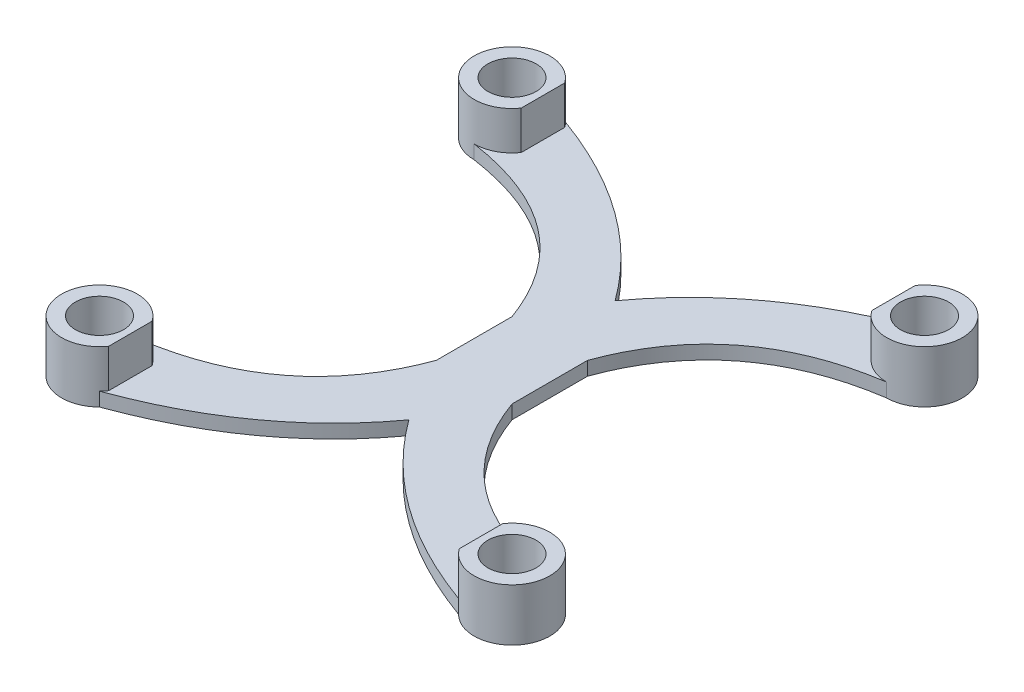
ISO-10303-21;
HEADER;
FILE_DESCRIPTION(('STEP AP214'),'2;1');
FILE_NAME('part.step','',(''),(''),'','','');
FILE_SCHEMA(('AUTOMOTIVE_DESIGN { 1 0 10303 214 1 1 1 1 }'));
ENDSEC;
DATA;
#1=APPLICATION_CONTEXT('core data for automotive mechanical design processes');
#2=APPLICATION_PROTOCOL_DEFINITION('international standard','automotive_design',2000,#1);
#3=PRODUCT_CONTEXT('',#1,'mechanical');
#4=PRODUCT('Part','Part','',(#3));
#5=PRODUCT_RELATED_PRODUCT_CATEGORY('part','',(#4));
#6=PRODUCT_DEFINITION_FORMATION('','',#4);
#7=PRODUCT_DEFINITION_CONTEXT('part definition',#1,'design');
#8=PRODUCT_DEFINITION('design','',#6,#7);
#9=PRODUCT_DEFINITION_SHAPE('','',#8);
#10=(LENGTH_UNIT() NAMED_UNIT(*) SI_UNIT(.MILLI.,.METRE.));
#11=(NAMED_UNIT(*) PLANE_ANGLE_UNIT() SI_UNIT($,.RADIAN.));
#12=(NAMED_UNIT(*) SI_UNIT($,.STERADIAN.) SOLID_ANGLE_UNIT());
#13=UNCERTAINTY_MEASURE_WITH_UNIT(LENGTH_MEASURE(1.E-05),#10,'distance_accuracy_value','');
#14=(GEOMETRIC_REPRESENTATION_CONTEXT(3) GLOBAL_UNCERTAINTY_ASSIGNED_CONTEXT((#13)) GLOBAL_UNIT_ASSIGNED_CONTEXT((#10,
#11,#12)) REPRESENTATION_CONTEXT('',''));
#15=CARTESIAN_POINT('',(0.,0.,0.));
#16=DIRECTION('',(0.,0.,1.));
#17=DIRECTION('',(1.,0.,0.));
#18=AXIS2_PLACEMENT_3D('',#15,#16,#17);
#19=CARTESIAN_POINT('',(0.,1.,0.));
#20=DIRECTION('',(0.,1.,0.));
#21=DIRECTION('',(0.,0.,1.));
#22=AXIS2_PLACEMENT_3D('',#19,#20,#21);
#23=PLANE('',#22);
#24=CARTESIAN_POINT('',(13.055456351737,1.,-16.944543648263));
#25=CARTESIAN_POINT('',(1.81322481001826,1.,-12.8640011613613));
#26=CARTESIAN_POINT('',(-2.75,1.,-2.75));
#27=B_SPLINE_CURVE_WITH_KNOTS('',2,(#24,#25,#26),.UNSPECIFIED.,.F.,.F.,(3,3),(0.,1.),.UNSPECIFIED.);
#28=CARTESIAN_POINT('',(13.055456351737,1.,-16.944543648263));
#29=VERTEX_POINT('',#28);
#30=CARTESIAN_POINT('',(5.38024486074207E-11,1.,-7.49999999992625));
#31=VERTEX_POINT('',#30);
#32=EDGE_CURVE('E302',#29,#31,#27,.T.);
#33=ORIENTED_EDGE('',*,*,#32,.T.);
#34=CARTESIAN_POINT('',(-13.055456351737,1.,-16.944543648263));
#35=CARTESIAN_POINT('',(-1.81322481001825,1.,-12.8640011613613));
#36=CARTESIAN_POINT('',(2.75,1.,-2.75));
#37=B_SPLINE_CURVE_WITH_KNOTS('',2,(#34,#35,#36),.UNSPECIFIED.,.F.,.F.,(3,3),(0.,1.),.UNSPECIFIED.);
#38=CARTESIAN_POINT('',(-13.055456351737,1.,-16.944543648263));
#39=VERTEX_POINT('',#38);
#40=EDGE_CURVE('E263',#39,#31,#37,.T.);
#41=ORIENTED_EDGE('',*,*,#40,.F.);
#42=CARTESIAN_POINT('',(-15.,1.,-15.));
#43=DIRECTION('',(0.,1.,0.));
#44=DIRECTION('',(0.,0.,1.));
#45=AXIS2_PLACEMENT_3D('',#42,#43,#44);
#46=CIRCLE('',#45,2.75);
#47=CARTESIAN_POINT('',(-12.75,1.,-16.5811388300842));
#48=VERTEX_POINT('',#47);
#49=EDGE_CURVE('E41',#48,#39,#46,.T.);
#50=ORIENTED_EDGE('',*,*,#49,.F.);
#51=DIRECTION('',(0.,0.,-1.));
#52=VECTOR('',#51,1.);
#53=CARTESIAN_POINT('',(-12.75,1.,-17.75));
#54=LINE('',#53,#52);
#55=CARTESIAN_POINT('',(-12.75,1.,-13.4188611699158));
#56=VERTEX_POINT('',#55);
#57=EDGE_CURVE('E205',#56,#48,#54,.T.);
#58=ORIENTED_EDGE('',*,*,#57,.F.);
#59=CARTESIAN_POINT('',(-15.,1.,-12.25));
#60=VERTEX_POINT('',#59);
#61=EDGE_CURVE('E244',#60,#56,#46,.T.);
#62=ORIENTED_EDGE('',*,*,#61,.F.);
#63=CARTESIAN_POINT('',(-15.,1.,-12.25));
#64=CARTESIAN_POINT('',(-5.70624646356832,1.,-10.8686922382826));
#65=CARTESIAN_POINT('',(-2.75,1.,-2.75));
#66=B_SPLINE_CURVE_WITH_KNOTS('',2,(#63,#64,#65),.UNSPECIFIED.,.F.,.F.,(3,3),(0.,1.),.UNSPECIFIED.);
#67=CARTESIAN_POINT('',(-2.75,1.,-2.75));
#68=VERTEX_POINT('',#67);
#69=EDGE_CURVE('E258',#60,#68,#66,.T.);
#70=ORIENTED_EDGE('',*,*,#69,.T.);
#71=DIRECTION('',(0.,0.,1.));
#72=VECTOR('',#71,1.);
#73=CARTESIAN_POINT('',(-2.75,1.,0.));
#74=LINE('',#73,#72);
#75=CARTESIAN_POINT('',(-2.75,1.,2.75));
#76=VERTEX_POINT('',#75);
#77=EDGE_CURVE('E262',#68,#76,#74,.T.);
#78=ORIENTED_EDGE('',*,*,#77,.T.);
#79=CARTESIAN_POINT('',(-15.,1.,12.25));
#80=CARTESIAN_POINT('',(-5.70624646356832,1.,10.8686922382826));
#81=CARTESIAN_POINT('',(-2.75,1.,2.75));
#82=B_SPLINE_CURVE_WITH_KNOTS('',2,(#79,#80,#81),.UNSPECIFIED.,.F.,.F.,(3,3),(0.,1.),.UNSPECIFIED.);
#83=CARTESIAN_POINT('',(-15.,1.,12.25));
#84=VERTEX_POINT('',#83);
#85=EDGE_CURVE('E389',#84,#76,#82,.T.);
#86=ORIENTED_EDGE('',*,*,#85,.F.);
#87=CARTESIAN_POINT('',(-15.,1.,15.));
#88=DIRECTION('',(0.,1.,0.));
#89=DIRECTION('',(0.,0.,-1.));
#90=AXIS2_PLACEMENT_3D('',#87,#88,#89);
#91=CIRCLE('',#90,2.75);
#92=CARTESIAN_POINT('',(-12.75,1.,13.4188611699158));
#93=VERTEX_POINT('',#92);
#94=EDGE_CURVE('E203',#93,#84,#91,.T.);
#95=ORIENTED_EDGE('',*,*,#94,.F.);
#96=CARTESIAN_POINT('',(-12.75,1.,16.5811388300842));
#97=VERTEX_POINT('',#96);
#98=EDGE_CURVE('E189',#97,#93,#54,.T.);
#99=ORIENTED_EDGE('',*,*,#98,.F.);
#100=CARTESIAN_POINT('',(-13.055456351737,1.,16.944543648263));
#101=VERTEX_POINT('',#100);
#102=EDGE_CURVE('E200',#101,#97,#91,.T.);
#103=ORIENTED_EDGE('',*,*,#102,.F.);
#104=CARTESIAN_POINT('',(-13.055456351737,1.,16.944543648263));
#105=CARTESIAN_POINT('',(-1.81322481001826,1.,12.8640011613613));
#106=CARTESIAN_POINT('',(2.75,1.,2.75));
#107=B_SPLINE_CURVE_WITH_KNOTS('',2,(#104,#105,#106),.UNSPECIFIED.,.F.,.F.,(3,3),(0.,1.),.UNSPECIFIED.);
#108=CARTESIAN_POINT('',(-5.37991960009032E-11,1.,7.49999999992625));
#109=VERTEX_POINT('',#108);
#110=EDGE_CURVE('E249',#101,#109,#107,.T.);
#111=ORIENTED_EDGE('',*,*,#110,.T.);
#112=CARTESIAN_POINT('',(13.055456351737,1.,16.944543648263));
#113=CARTESIAN_POINT('',(1.81322481001826,1.,12.8640011613613));
#114=CARTESIAN_POINT('',(-2.75,1.,2.75));
#115=B_SPLINE_CURVE_WITH_KNOTS('',2,(#112,#113,#114),.UNSPECIFIED.,.F.,.F.,(3,3),(0.,1.),.UNSPECIFIED.);
#116=CARTESIAN_POINT('',(13.055456351737,1.,16.944543648263));
#117=VERTEX_POINT('',#116);
#118=EDGE_CURVE('E338',#117,#109,#115,.T.);
#119=ORIENTED_EDGE('',*,*,#118,.F.);
#120=CARTESIAN_POINT('',(15.,1.,15.));
#121=DIRECTION('',(0.,1.,0.));
#122=DIRECTION('',(0.,0.,1.));
#123=AXIS2_PLACEMENT_3D('',#120,#121,#122);
#124=CIRCLE('',#123,2.75);
#125=CARTESIAN_POINT('',(12.75,1.,16.5811388300842));
#126=VERTEX_POINT('',#125);
#127=EDGE_CURVE('E227',#126,#117,#124,.T.);
#128=ORIENTED_EDGE('',*,*,#127,.F.);
#129=DIRECTION('',(0.,0.,1.));
#130=VECTOR('',#129,1.);
#131=CARTESIAN_POINT('',(12.75,1.,-17.75));
#132=LINE('',#131,#130);
#133=CARTESIAN_POINT('',(12.75,1.,13.4188611699158));
#134=VERTEX_POINT('',#133);
#135=EDGE_CURVE('E544',#134,#126,#132,.T.);
#136=ORIENTED_EDGE('',*,*,#135,.F.);
#137=CARTESIAN_POINT('',(15.,1.,12.25));
#138=VERTEX_POINT('',#137);
#139=EDGE_CURVE('E224',#138,#134,#124,.T.);
#140=ORIENTED_EDGE('',*,*,#139,.F.);
#141=CARTESIAN_POINT('',(15.,1.,12.25));
#142=CARTESIAN_POINT('',(5.70624646356832,1.,10.8686922382826));
#143=CARTESIAN_POINT('',(2.75,1.,2.75));
#144=B_SPLINE_CURVE_WITH_KNOTS('',2,(#141,#142,#143),.UNSPECIFIED.,.F.,.F.,(3,3),(0.,1.),.UNSPECIFIED.);
#145=CARTESIAN_POINT('',(2.75,1.,2.75));
#146=VERTEX_POINT('',#145);
#147=EDGE_CURVE('E334',#138,#146,#144,.T.);
#148=ORIENTED_EDGE('',*,*,#147,.T.);
#149=DIRECTION('',(0.,0.,1.));
#150=VECTOR('',#149,1.);
#151=CARTESIAN_POINT('',(2.75,1.,0.));
#152=LINE('',#151,#150);
#153=CARTESIAN_POINT('',(2.75,1.,-2.75));
#154=VERTEX_POINT('',#153);
#155=EDGE_CURVE('E315',#154,#146,#152,.T.);
#156=ORIENTED_EDGE('',*,*,#155,.F.);
#157=CARTESIAN_POINT('',(15.,1.,-12.25));
#158=CARTESIAN_POINT('',(5.70624646356832,1.,-10.8686922382826));
#159=CARTESIAN_POINT('',(2.75,1.,-2.75));
#160=B_SPLINE_CURVE_WITH_KNOTS('',2,(#157,#158,#159),.UNSPECIFIED.,.F.,.F.,(3,3),(0.,1.),.UNSPECIFIED.);
#161=CARTESIAN_POINT('',(15.,1.,-12.25));
#162=VERTEX_POINT('',#161);
#163=EDGE_CURVE('E307',#162,#154,#160,.T.);
#164=ORIENTED_EDGE('',*,*,#163,.F.);
#165=CARTESIAN_POINT('',(15.,1.,-15.));
#166=DIRECTION('',(0.,1.,0.));
#167=DIRECTION('',(0.,0.,-1.));
#168=AXIS2_PLACEMENT_3D('',#165,#166,#167);
#169=CIRCLE('',#168,2.75);
#170=CARTESIAN_POINT('',(12.75,1.,-13.4188611699158));
#171=VERTEX_POINT('',#170);
#172=EDGE_CURVE('E237',#171,#162,#169,.T.);
#173=ORIENTED_EDGE('',*,*,#172,.F.);
#174=CARTESIAN_POINT('',(12.75,1.,-16.5811388300842));
#175=VERTEX_POINT('',#174);
#176=EDGE_CURVE('E606',#175,#171,#132,.T.);
#177=ORIENTED_EDGE('',*,*,#176,.F.);
#178=EDGE_CURVE('E234',#29,#175,#169,.T.);
#179=ORIENTED_EDGE('',*,*,#178,.F.);
#180=EDGE_LOOP('',(#33,#41,#50,#58,#62,#70,#78,#86,#95,#99,#103,#111,#119,#128,#136,#140,#148,
#156,#164,#173,#177,#179));
#181=FACE_BOUND('',#180,.T.);
#182=ADVANCED_FACE('F37',(#181),#23,.T.);
#183=CARTESIAN_POINT('',(-15.,1.,15.));
#184=DIRECTION('',(0.,-1.,0.));
#185=DIRECTION('',(0.,0.,-1.));
#186=AXIS2_PLACEMENT_3D('',#183,#184,#185);
#187=CYLINDRICAL_SURFACE('',#186,2.75);
#188=DIRECTION('',(0.,-1.,0.));
#189=VECTOR('',#188,1.);
#190=CARTESIAN_POINT('',(-12.75,1.,13.4188611699158));
#191=LINE('',#190,#189);
#192=CARTESIAN_POINT('',(-12.75,3.8,13.4188611699158));
#193=VERTEX_POINT('',#192);
#194=EDGE_CURVE('E196',#93,#193,#191,.F.);
#195=ORIENTED_EDGE('',*,*,#194,.F.);
#196=ORIENTED_EDGE('',*,*,#94,.T.);
#197=DIRECTION('',(0.,-1.,0.));
#198=VECTOR('',#197,1.);
#199=CARTESIAN_POINT('',(-15.,1.,12.25));
#200=LINE('',#199,#198);
#201=CARTESIAN_POINT('',(-15.,0.,12.25));
#202=VERTEX_POINT('',#201);
#203=EDGE_CURVE('E394',#84,#202,#200,.T.);
#204=ORIENTED_EDGE('',*,*,#203,.T.);
#205=CARTESIAN_POINT('',(-15.,0.,15.));
#206=DIRECTION('',(0.,1.,0.));
#207=DIRECTION('',(0.,0.,1.));
#208=AXIS2_PLACEMENT_3D('',#205,#206,#207);
#209=CIRCLE('',#208,2.75);
#210=CARTESIAN_POINT('',(-13.055456351737,0.,16.944543648263));
#211=VERTEX_POINT('',#210);
#212=EDGE_CURVE('E243',#211,#202,#209,.F.);
#213=ORIENTED_EDGE('',*,*,#212,.F.);
#214=DIRECTION('',(0.,-1.,0.));
#215=VECTOR('',#214,1.);
#216=CARTESIAN_POINT('',(-13.055456351737,1.,16.944543648263));
#217=LINE('',#216,#215);
#218=EDGE_CURVE('E208',#101,#211,#217,.T.);
#219=ORIENTED_EDGE('',*,*,#218,.F.);
#220=ORIENTED_EDGE('',*,*,#102,.T.);
#221=DIRECTION('',(0.,-1.,0.));
#222=VECTOR('',#221,1.);
#223=CARTESIAN_POINT('',(-12.75,1.,16.5811388300842));
#224=LINE('',#223,#222);
#225=CARTESIAN_POINT('',(-12.75,3.8,16.5811388300842));
#226=VERTEX_POINT('',#225);
#227=EDGE_CURVE('E186',#226,#97,#224,.T.);
#228=ORIENTED_EDGE('',*,*,#227,.F.);
#229=CARTESIAN_POINT('',(-15.,3.8,15.));
#230=DIRECTION('',(0.,1.,0.));
#231=DIRECTION('',(0.,0.,1.));
#232=AXIS2_PLACEMENT_3D('',#229,#230,#231);
#233=CIRCLE('',#232,2.75);
#234=EDGE_CURVE('E210',#193,#226,#233,.T.);
#235=ORIENTED_EDGE('',*,*,#234,.F.);
#236=EDGE_LOOP('',(#195,#196,#204,#213,#219,#220,#228,#235));
#237=FACE_BOUND('',#236,.T.);
#238=ADVANCED_FACE('F39',(#237),#187,.T.);
#239=DIRECTION('',(0.,-1.,0.));
#240=VECTOR('',#239,1.);
#241=SURFACE_OF_LINEAR_EXTRUSION('',#107,#240);
#242=CARTESIAN_POINT('',(-13.055456351737,0.,16.944543648263));
#243=CARTESIAN_POINT('',(-1.81322481001826,0.,12.8640011613613));
#244=CARTESIAN_POINT('',(2.75,0.,2.75));
#245=B_SPLINE_CURVE_WITH_KNOTS('',2,(#242,#243,#244),.UNSPECIFIED.,.F.,.F.,(3,3),(0.,1.),.UNSPECIFIED.);
#246=CARTESIAN_POINT('',(-5.37991960009032E-11,0.,7.49999999992625));
#247=VERTEX_POINT('',#246);
#248=EDGE_CURVE('E400',#211,#247,#245,.T.);
#249=ORIENTED_EDGE('',*,*,#248,.T.);
#250=DIRECTION('',(0.,-1.,0.));
#251=VECTOR('',#250,1.);
#252=CARTESIAN_POINT('',(-5.37991960009032E-11,1.,7.49999999992625));
#253=LINE('',#252,#251);
#254=EDGE_CURVE('E508',#109,#247,#253,.T.);
#255=ORIENTED_EDGE('',*,*,#254,.F.);
#256=ORIENTED_EDGE('',*,*,#110,.F.);
#257=ORIENTED_EDGE('',*,*,#218,.T.);
#258=EDGE_LOOP('',(#249,#255,#256,#257));
#259=FACE_BOUND('',#258,.T.);
#260=ADVANCED_FACE('F351',(#259),#241,.F.);
#261=DIRECTION('',(0.,-1.,0.));
#262=VECTOR('',#261,1.);
#263=SURFACE_OF_LINEAR_EXTRUSION('',#115,#262);
#264=CARTESIAN_POINT('',(13.055456351737,0.,16.944543648263));
#265=CARTESIAN_POINT('',(1.81322481001826,0.,12.8640011613613));
#266=CARTESIAN_POINT('',(-2.75,0.,2.75));
#267=B_SPLINE_CURVE_WITH_KNOTS('',2,(#264,#265,#266),.UNSPECIFIED.,.F.,.F.,(3,3),(0.,1.),.UNSPECIFIED.);
#268=CARTESIAN_POINT('',(13.055456351737,0.,16.944543648263));
#269=VERTEX_POINT('',#268);
#270=EDGE_CURVE('E404',#269,#247,#267,.T.);
#271=ORIENTED_EDGE('',*,*,#270,.F.);
#272=DIRECTION('',(0.,-1.,0.));
#273=VECTOR('',#272,1.);
#274=CARTESIAN_POINT('',(13.055456351737,1.,16.944543648263));
#275=LINE('',#274,#273);
#276=EDGE_CURVE('E507',#117,#269,#275,.T.);
#277=ORIENTED_EDGE('',*,*,#276,.F.);
#278=ORIENTED_EDGE('',*,*,#118,.T.);
#279=ORIENTED_EDGE('',*,*,#254,.T.);
#280=EDGE_LOOP('',(#271,#277,#278,#279));
#281=FACE_BOUND('',#280,.T.);
#282=ADVANCED_FACE('F349',(#281),#263,.T.);
#283=CARTESIAN_POINT('',(15.,1.,15.));
#284=DIRECTION('',(0.,-1.,0.));
#285=DIRECTION('',(0.,0.,-1.));
#286=AXIS2_PLACEMENT_3D('',#283,#284,#285);
#287=CYLINDRICAL_SURFACE('',#286,2.75);
#288=CARTESIAN_POINT('',(15.,3.8,15.));
#289=DIRECTION('',(0.,1.,0.));
#290=DIRECTION('',(0.,0.,1.));
#291=AXIS2_PLACEMENT_3D('',#288,#289,#290);
#292=CIRCLE('',#291,2.75);
#293=CARTESIAN_POINT('',(12.75,3.8,16.5811388300842));
#294=VERTEX_POINT('',#293);
#295=CARTESIAN_POINT('',(12.75,3.8,13.4188611699158));
#296=VERTEX_POINT('',#295);
#297=EDGE_CURVE('E220',#294,#296,#292,.T.);
#298=ORIENTED_EDGE('',*,*,#297,.F.);
#299=DIRECTION('',(0.,-1.,0.));
#300=VECTOR('',#299,1.);
#301=CARTESIAN_POINT('',(12.75,1.,16.5811388300842));
#302=LINE('',#301,#300);
#303=EDGE_CURVE('E219',#294,#126,#302,.T.);
#304=ORIENTED_EDGE('',*,*,#303,.T.);
#305=ORIENTED_EDGE('',*,*,#127,.T.);
#306=ORIENTED_EDGE('',*,*,#276,.T.);
#307=CARTESIAN_POINT('',(15.,0.,15.));
#308=DIRECTION('',(0.,1.,0.));
#309=DIRECTION('',(0.,0.,1.));
#310=AXIS2_PLACEMENT_3D('',#307,#308,#309);
#311=CIRCLE('',#310,2.75);
#312=CARTESIAN_POINT('',(15.,0.,12.25));
#313=VERTEX_POINT('',#312);
#314=EDGE_CURVE('E412',#269,#313,#311,.T.);
#315=ORIENTED_EDGE('',*,*,#314,.T.);
#316=DIRECTION('',(0.,-1.,0.));
#317=VECTOR('',#316,1.);
#318=CARTESIAN_POINT('',(15.,1.,12.25));
#319=LINE('',#318,#317);
#320=EDGE_CURVE('E504',#138,#313,#319,.T.);
#321=ORIENTED_EDGE('',*,*,#320,.F.);
#322=ORIENTED_EDGE('',*,*,#139,.T.);
#323=DIRECTION('',(0.,-1.,0.));
#324=VECTOR('',#323,1.);
#325=CARTESIAN_POINT('',(12.75,1.,13.4188611699158));
#326=LINE('',#325,#324);
#327=EDGE_CURVE('E553',#134,#296,#326,.F.);
#328=ORIENTED_EDGE('',*,*,#327,.T.);
#329=EDGE_LOOP('',(#298,#304,#305,#306,#315,#321,#322,#328));
#330=FACE_BOUND('',#329,.T.);
#331=ADVANCED_FACE('F331',(#330),#287,.T.);
#332=DIRECTION('',(0.,-1.,0.));
#333=VECTOR('',#332,1.);
#334=SURFACE_OF_LINEAR_EXTRUSION('',#144,#333);
#335=CARTESIAN_POINT('',(15.,0.,12.25));
#336=CARTESIAN_POINT('',(5.70624646356832,0.,10.8686922382826));
#337=CARTESIAN_POINT('',(2.75,0.,2.75));
#338=B_SPLINE_CURVE_WITH_KNOTS('',2,(#335,#336,#337),.UNSPECIFIED.,.F.,.F.,(3,3),(0.,1.),.UNSPECIFIED.);
#339=CARTESIAN_POINT('',(2.75,0.,2.75));
#340=VERTEX_POINT('',#339);
#341=EDGE_CURVE('E417',#313,#340,#338,.T.);
#342=ORIENTED_EDGE('',*,*,#341,.T.);
#343=DIRECTION('',(0.,-1.,0.));
#344=VECTOR('',#343,1.);
#345=CARTESIAN_POINT('',(2.75,1.,2.75));
#346=LINE('',#345,#344);
#347=EDGE_CURVE('E502',#146,#340,#346,.T.);
#348=ORIENTED_EDGE('',*,*,#347,.F.);
#349=ORIENTED_EDGE('',*,*,#147,.F.);
#350=ORIENTED_EDGE('',*,*,#320,.T.);
#351=EDGE_LOOP('',(#342,#348,#349,#350));
#352=FACE_BOUND('',#351,.T.);
#353=ADVANCED_FACE('F327',(#352),#334,.F.);
#354=CARTESIAN_POINT('',(2.75,1.,0.));
#355=DIRECTION('',(1.,0.,0.));
#356=DIRECTION('',(0.,0.,-1.));
#357=AXIS2_PLACEMENT_3D('',#354,#355,#356);
#358=PLANE('',#357);
#359=DIRECTION('',(0.,0.,1.));
#360=VECTOR('',#359,1.);
#361=CARTESIAN_POINT('',(2.75,0.,0.));
#362=LINE('',#361,#360);
#363=CARTESIAN_POINT('',(2.75,0.,-2.75));
#364=VERTEX_POINT('',#363);
#365=EDGE_CURVE('E422',#364,#340,#362,.T.);
#366=ORIENTED_EDGE('',*,*,#365,.F.);
#367=DIRECTION('',(0.,-1.,0.));
#368=VECTOR('',#367,1.);
#369=CARTESIAN_POINT('',(2.75,1.,-2.75));
#370=LINE('',#369,#368);
#371=EDGE_CURVE('E500',#154,#364,#370,.T.);
#372=ORIENTED_EDGE('',*,*,#371,.F.);
#373=ORIENTED_EDGE('',*,*,#155,.T.);
#374=ORIENTED_EDGE('',*,*,#347,.T.);
#375=EDGE_LOOP('',(#366,#372,#373,#374));
#376=FACE_BOUND('',#375,.T.);
#377=ADVANCED_FACE('F323',(#376),#358,.T.);
#378=DIRECTION('',(0.,-1.,0.));
#379=VECTOR('',#378,1.);
#380=SURFACE_OF_LINEAR_EXTRUSION('',#160,#379);
#381=CARTESIAN_POINT('',(15.,0.,-12.25));
#382=CARTESIAN_POINT('',(5.70624646356832,0.,-10.8686922382826));
#383=CARTESIAN_POINT('',(2.75,0.,-2.75));
#384=B_SPLINE_CURVE_WITH_KNOTS('',2,(#381,#382,#383),.UNSPECIFIED.,.F.,.F.,(3,3),(0.,1.),.UNSPECIFIED.);
#385=CARTESIAN_POINT('',(15.,0.,-12.25));
#386=VERTEX_POINT('',#385);
#387=EDGE_CURVE('E428',#386,#364,#384,.T.);
#388=ORIENTED_EDGE('',*,*,#387,.F.);
#389=DIRECTION('',(0.,-1.,0.));
#390=VECTOR('',#389,1.);
#391=CARTESIAN_POINT('',(15.,1.,-12.25));
#392=LINE('',#391,#390);
#393=EDGE_CURVE('E498',#162,#386,#392,.T.);
#394=ORIENTED_EDGE('',*,*,#393,.F.);
#395=ORIENTED_EDGE('',*,*,#163,.T.);
#396=ORIENTED_EDGE('',*,*,#371,.T.);
#397=EDGE_LOOP('',(#388,#394,#395,#396));
#398=FACE_BOUND('',#397,.T.);
#399=ADVANCED_FACE('F320',(#398),#380,.T.);
#400=CARTESIAN_POINT('',(15.,1.,-15.));
#401=DIRECTION('',(0.,-1.,0.));
#402=DIRECTION('',(0.,0.,-1.));
#403=AXIS2_PLACEMENT_3D('',#400,#401,#402);
#404=CYLINDRICAL_SURFACE('',#403,2.75);
#405=DIRECTION('',(0.,-1.,0.));
#406=VECTOR('',#405,1.);
#407=CARTESIAN_POINT('',(12.75,1.,-13.4188611699158));
#408=LINE('',#407,#406);
#409=CARTESIAN_POINT('',(12.75,3.8,-13.4188611699158));
#410=VERTEX_POINT('',#409);
#411=EDGE_CURVE('E62',#171,#410,#408,.F.);
#412=ORIENTED_EDGE('',*,*,#411,.F.);
#413=ORIENTED_EDGE('',*,*,#172,.T.);
#414=ORIENTED_EDGE('',*,*,#393,.T.);
#415=CARTESIAN_POINT('',(15.,0.,-15.));
#416=DIRECTION('',(0.,1.,0.));
#417=DIRECTION('',(0.,0.,1.));
#418=AXIS2_PLACEMENT_3D('',#415,#416,#417);
#419=CIRCLE('',#418,2.75);
#420=CARTESIAN_POINT('',(13.055456351737,0.,-16.944543648263));
#421=VERTEX_POINT('',#420);
#422=EDGE_CURVE('E433',#421,#386,#419,.F.);
#423=ORIENTED_EDGE('',*,*,#422,.F.);
#424=DIRECTION('',(0.,-1.,0.));
#425=VECTOR('',#424,1.);
#426=CARTESIAN_POINT('',(13.055456351737,1.,-16.944543648263));
#427=LINE('',#426,#425);
#428=EDGE_CURVE('E495',#29,#421,#427,.T.);
#429=ORIENTED_EDGE('',*,*,#428,.F.);
#430=ORIENTED_EDGE('',*,*,#178,.T.);
#431=DIRECTION('',(0.,-1.,0.));
#432=VECTOR('',#431,1.);
#433=CARTESIAN_POINT('',(12.75,1.,-16.5811388300842));
#434=LINE('',#433,#432);
#435=CARTESIAN_POINT('',(12.75,3.8,-16.5811388300842));
#436=VERTEX_POINT('',#435);
#437=EDGE_CURVE('E550',#436,#175,#434,.T.);
#438=ORIENTED_EDGE('',*,*,#437,.F.);
#439=CARTESIAN_POINT('',(15.,3.8,-15.));
#440=DIRECTION('',(0.,1.,0.));
#441=DIRECTION('',(0.,0.,1.));
#442=AXIS2_PLACEMENT_3D('',#439,#440,#441);
#443=CIRCLE('',#442,2.75);
#444=EDGE_CURVE('E230',#410,#436,#443,.T.);
#445=ORIENTED_EDGE('',*,*,#444,.F.);
#446=EDGE_LOOP('',(#412,#413,#414,#423,#429,#430,#438,#445));
#447=FACE_BOUND('',#446,.T.);
#448=ADVANCED_FACE('F299',(#447),#404,.T.);
#449=DIRECTION('',(0.,-1.,0.));
#450=VECTOR('',#449,1.);
#451=SURFACE_OF_LINEAR_EXTRUSION('',#27,#450);
#452=CARTESIAN_POINT('',(13.055456351737,0.,-16.944543648263));
#453=CARTESIAN_POINT('',(1.81322481001826,0.,-12.8640011613613));
#454=CARTESIAN_POINT('',(-2.75,0.,-2.75));
#455=B_SPLINE_CURVE_WITH_KNOTS('',2,(#452,#453,#454),.UNSPECIFIED.,.F.,.F.,(3,3),(0.,1.),.UNSPECIFIED.);
#456=CARTESIAN_POINT('',(5.38024486074207E-11,0.,-7.49999999992625));
#457=VERTEX_POINT('',#456);
#458=EDGE_CURVE('E439',#421,#457,#455,.T.);
#459=ORIENTED_EDGE('',*,*,#458,.T.);
#460=DIRECTION('',(0.,-1.,0.));
#461=VECTOR('',#460,1.);
#462=CARTESIAN_POINT('',(5.38024486074207E-11,1.,-7.49999999992625));
#463=LINE('',#462,#461);
#464=EDGE_CURVE('E493',#31,#457,#463,.T.);
#465=ORIENTED_EDGE('',*,*,#464,.F.);
#466=ORIENTED_EDGE('',*,*,#32,.F.);
#467=ORIENTED_EDGE('',*,*,#428,.T.);
#468=EDGE_LOOP('',(#459,#465,#466,#467));
#469=FACE_BOUND('',#468,.T.);
#470=ADVANCED_FACE('F295',(#469),#451,.F.);
#471=DIRECTION('',(0.,-1.,0.));
#472=VECTOR('',#471,1.);
#473=SURFACE_OF_LINEAR_EXTRUSION('',#37,#472);
#474=CARTESIAN_POINT('',(-13.055456351737,0.,-16.944543648263));
#475=CARTESIAN_POINT('',(-1.81322481001825,0.,-12.8640011613613));
#476=CARTESIAN_POINT('',(2.75,0.,-2.75));
#477=B_SPLINE_CURVE_WITH_KNOTS('',2,(#474,#475,#476),.UNSPECIFIED.,.F.,.F.,(3,3),(0.,1.),.UNSPECIFIED.);
#478=CARTESIAN_POINT('',(-13.055456351737,0.,-16.944543648263));
#479=VERTEX_POINT('',#478);
#480=EDGE_CURVE('E444',#479,#457,#477,.T.);
#481=ORIENTED_EDGE('',*,*,#480,.F.);
#482=DIRECTION('',(0.,-1.,0.));
#483=VECTOR('',#482,1.);
#484=CARTESIAN_POINT('',(-13.055456351737,1.,-16.944543648263));
#485=LINE('',#484,#483);
#486=EDGE_CURVE('E496',#39,#479,#485,.T.);
#487=ORIENTED_EDGE('',*,*,#486,.F.);
#488=ORIENTED_EDGE('',*,*,#40,.T.);
#489=ORIENTED_EDGE('',*,*,#464,.T.);
#490=EDGE_LOOP('',(#481,#487,#488,#489));
#491=FACE_BOUND('',#490,.T.);
#492=ADVANCED_FACE('F291',(#491),#473,.T.);
#493=CARTESIAN_POINT('',(-15.,1.,-15.));
#494=DIRECTION('',(0.,-1.,0.));
#495=DIRECTION('',(0.,0.,-1.));
#496=AXIS2_PLACEMENT_3D('',#493,#494,#495);
#497=CYLINDRICAL_SURFACE('',#496,2.75);
#498=CARTESIAN_POINT('',(-15.,3.8,-15.));
#499=DIRECTION('',(0.,1.,0.));
#500=DIRECTION('',(0.,0.,1.));
#501=AXIS2_PLACEMENT_3D('',#498,#499,#500);
#502=CIRCLE('',#501,2.75);
#503=CARTESIAN_POINT('',(-12.75,3.8,-16.5811388300842));
#504=VERTEX_POINT('',#503);
#505=CARTESIAN_POINT('',(-12.75,3.8,-13.4188611699158));
#506=VERTEX_POINT('',#505);
#507=EDGE_CURVE('E240',#504,#506,#502,.T.);
#508=ORIENTED_EDGE('',*,*,#507,.F.);
#509=DIRECTION('',(0.,-1.,0.));
#510=VECTOR('',#509,1.);
#511=CARTESIAN_POINT('',(-12.75,1.,-16.5811388300842));
#512=LINE('',#511,#510);
#513=EDGE_CURVE('E54',#504,#48,#512,.T.);
#514=ORIENTED_EDGE('',*,*,#513,.T.);
#515=ORIENTED_EDGE('',*,*,#49,.T.);
#516=ORIENTED_EDGE('',*,*,#486,.T.);
#517=CARTESIAN_POINT('',(-15.,0.,-15.));
#518=DIRECTION('',(0.,1.,0.));
#519=DIRECTION('',(0.,0.,1.));
#520=AXIS2_PLACEMENT_3D('',#517,#518,#519);
#521=CIRCLE('',#520,2.75);
#522=CARTESIAN_POINT('',(-15.,0.,-12.25));
#523=VERTEX_POINT('',#522);
#524=EDGE_CURVE('E452',#479,#523,#521,.T.);
#525=ORIENTED_EDGE('',*,*,#524,.T.);
#526=DIRECTION('',(0.,-1.,0.));
#527=VECTOR('',#526,1.);
#528=CARTESIAN_POINT('',(-15.,1.,-12.25));
#529=LINE('',#528,#527);
#530=EDGE_CURVE('E264',#60,#523,#529,.T.);
#531=ORIENTED_EDGE('',*,*,#530,.F.);
#532=ORIENTED_EDGE('',*,*,#61,.T.);
#533=DIRECTION('',(0.,-1.,0.));
#534=VECTOR('',#533,1.);
#535=CARTESIAN_POINT('',(-12.75,1.,-13.4188611699158));
#536=LINE('',#535,#534);
#537=EDGE_CURVE('E204',#56,#506,#536,.F.);
#538=ORIENTED_EDGE('',*,*,#537,.T.);
#539=EDGE_LOOP('',(#508,#514,#515,#516,#525,#531,#532,#538));
#540=FACE_BOUND('',#539,.T.);
#541=ADVANCED_FACE('F286',(#540),#497,.T.);
#542=DIRECTION('',(0.,-1.,0.));
#543=VECTOR('',#542,1.);
#544=SURFACE_OF_LINEAR_EXTRUSION('',#66,#543);
#545=CARTESIAN_POINT('',(-15.,0.,-12.25));
#546=CARTESIAN_POINT('',(-5.70624646356832,0.,-10.8686922382826));
#547=CARTESIAN_POINT('',(-2.75,0.,-2.75));
#548=B_SPLINE_CURVE_WITH_KNOTS('',2,(#545,#546,#547),.UNSPECIFIED.,.F.,.F.,(3,3),(0.,1.),.UNSPECIFIED.);
#549=CARTESIAN_POINT('',(-2.75,0.,-2.75));
#550=VERTEX_POINT('',#549);
#551=EDGE_CURVE('E457',#523,#550,#548,.T.);
#552=ORIENTED_EDGE('',*,*,#551,.T.);
#553=DIRECTION('',(0.,-1.,0.));
#554=VECTOR('',#553,1.);
#555=CARTESIAN_POINT('',(-2.75,1.,-2.75));
#556=LINE('',#555,#554);
#557=EDGE_CURVE('E490',#68,#550,#556,.T.);
#558=ORIENTED_EDGE('',*,*,#557,.F.);
#559=ORIENTED_EDGE('',*,*,#69,.F.);
#560=ORIENTED_EDGE('',*,*,#530,.T.);
#561=EDGE_LOOP('',(#552,#558,#559,#560));
#562=FACE_BOUND('',#561,.T.);
#563=ADVANCED_FACE('F281',(#562),#544,.F.);
#564=CARTESIAN_POINT('',(-2.75,1.,0.));
#565=DIRECTION('',(1.,0.,0.));
#566=DIRECTION('',(0.,0.,-1.));
#567=AXIS2_PLACEMENT_3D('',#564,#565,#566);
#568=PLANE('',#567);
#569=DIRECTION('',(0.,0.,1.));
#570=VECTOR('',#569,1.);
#571=CARTESIAN_POINT('',(-2.75,0.,0.));
#572=LINE('',#571,#570);
#573=CARTESIAN_POINT('',(-2.75,0.,2.75));
#574=VERTEX_POINT('',#573);
#575=EDGE_CURVE('E461',#550,#574,#572,.T.);
#576=ORIENTED_EDGE('',*,*,#575,.T.);
#577=DIRECTION('',(0.,-1.,0.));
#578=VECTOR('',#577,1.);
#579=CARTESIAN_POINT('',(-2.75,1.,2.75));
#580=LINE('',#579,#578);
#581=EDGE_CURVE('E488',#76,#574,#580,.T.);
#582=ORIENTED_EDGE('',*,*,#581,.F.);
#583=ORIENTED_EDGE('',*,*,#77,.F.);
#584=ORIENTED_EDGE('',*,*,#557,.T.);
#585=EDGE_LOOP('',(#576,#582,#583,#584));
#586=FACE_BOUND('',#585,.T.);
#587=ADVANCED_FACE('F285',(#586),#568,.F.);
#588=CARTESIAN_POINT('',(-15.,1.,-15.));
#589=DIRECTION('',(0.,-1.,0.));
#590=DIRECTION('',(0.,0.,-1.));
#591=AXIS2_PLACEMENT_3D('',#588,#589,#590);
#592=CYLINDRICAL_SURFACE('',#591,1.75);
#593=CARTESIAN_POINT('',(-15.,0.,-15.));
#594=DIRECTION('',(0.,1.,0.));
#595=DIRECTION('',(0.,0.,1.));
#596=AXIS2_PLACEMENT_3D('',#593,#594,#595);
#597=CIRCLE('',#596,1.75);
#598=CARTESIAN_POINT('',(-15.,0.,-13.25));
#599=VERTEX_POINT('',#598);
#600=EDGE_CURVE('E481',#599,#599,#597,.T.);
#601=ORIENTED_EDGE('',*,*,#600,.F.);
#602=EDGE_LOOP('',(#601));
#603=FACE_BOUND('',#602,.T.);
#604=CARTESIAN_POINT('',(-15.,3.8,-15.));
#605=DIRECTION('',(0.,1.,0.));
#606=DIRECTION('',(0.,0.,1.));
#607=AXIS2_PLACEMENT_3D('',#604,#605,#606);
#608=CIRCLE('',#607,1.75);
#609=CARTESIAN_POINT('',(-15.,3.8,-13.25));
#610=VERTEX_POINT('',#609);
#611=EDGE_CURVE('E233',#610,#610,#608,.T.);
#612=ORIENTED_EDGE('',*,*,#611,.T.);
#613=EDGE_LOOP('',(#612));
#614=FACE_BOUND('',#613,.T.);
#615=ADVANCED_FACE('F376',(#603,#614),#592,.F.);
#616=CARTESIAN_POINT('',(15.,1.,15.));
#617=DIRECTION('',(0.,-1.,0.));
#618=DIRECTION('',(0.,0.,-1.));
#619=AXIS2_PLACEMENT_3D('',#616,#617,#618);
#620=CYLINDRICAL_SURFACE('',#619,1.75);
#621=CARTESIAN_POINT('',(15.,0.,15.));
#622=DIRECTION('',(0.,1.,0.));
#623=DIRECTION('',(0.,0.,1.));
#624=AXIS2_PLACEMENT_3D('',#621,#622,#623);
#625=CIRCLE('',#624,1.75);
#626=CARTESIAN_POINT('',(15.,0.,16.75));
#627=VERTEX_POINT('',#626);
#628=EDGE_CURVE('E478',#627,#627,#625,.T.);
#629=ORIENTED_EDGE('',*,*,#628,.F.);
#630=EDGE_LOOP('',(#629));
#631=FACE_BOUND('',#630,.T.);
#632=CARTESIAN_POINT('',(15.,3.8,15.));
#633=DIRECTION('',(0.,1.,0.));
#634=DIRECTION('',(0.,0.,1.));
#635=AXIS2_PLACEMENT_3D('',#632,#633,#634);
#636=CIRCLE('',#635,1.74999999999999);
#637=CARTESIAN_POINT('',(15.,3.8,16.75));
#638=VERTEX_POINT('',#637);
#639=EDGE_CURVE('E212',#638,#638,#636,.T.);
#640=ORIENTED_EDGE('',*,*,#639,.T.);
#641=EDGE_LOOP('',(#640));
#642=FACE_BOUND('',#641,.T.);
#643=ADVANCED_FACE('F379',(#631,#642),#620,.F.);
#644=CARTESIAN_POINT('',(-15.,1.,15.));
#645=DIRECTION('',(0.,-1.,0.));
#646=DIRECTION('',(0.,0.,-1.));
#647=AXIS2_PLACEMENT_3D('',#644,#645,#646);
#648=CYLINDRICAL_SURFACE('',#647,1.75);
#649=CARTESIAN_POINT('',(-15.,0.,15.));
#650=DIRECTION('',(0.,1.,0.));
#651=DIRECTION('',(0.,0.,1.));
#652=AXIS2_PLACEMENT_3D('',#649,#650,#651);
#653=CIRCLE('',#652,1.75);
#654=CARTESIAN_POINT('',(-15.,0.,16.75));
#655=VERTEX_POINT('',#654);
#656=EDGE_CURVE('E472',#655,#655,#653,.F.);
#657=ORIENTED_EDGE('',*,*,#656,.T.);
#658=EDGE_LOOP('',(#657));
#659=FACE_BOUND('',#658,.T.);
#660=CARTESIAN_POINT('',(-15.,3.8,15.));
#661=DIRECTION('',(0.,1.,0.));
#662=DIRECTION('',(0.,0.,1.));
#663=AXIS2_PLACEMENT_3D('',#660,#661,#662);
#664=CIRCLE('',#663,1.75);
#665=CARTESIAN_POINT('',(-15.,3.8,16.75));
#666=VERTEX_POINT('',#665);
#667=EDGE_CURVE('E214',#666,#666,#664,.T.);
#668=ORIENTED_EDGE('',*,*,#667,.T.);
#669=EDGE_LOOP('',(#668));
#670=FACE_BOUND('',#669,.T.);
#671=ADVANCED_FACE('F383',(#659,#670),#648,.F.);
#672=DIRECTION('',(0.,-1.,0.));
#673=VECTOR('',#672,1.);
#674=SURFACE_OF_LINEAR_EXTRUSION('',#82,#673);
#675=CARTESIAN_POINT('',(-15.,0.,12.25));
#676=CARTESIAN_POINT('',(-5.70624646356832,0.,10.8686922382826));
#677=CARTESIAN_POINT('',(-2.75,0.,2.75));
#678=B_SPLINE_CURVE_WITH_KNOTS('',2,(#675,#676,#677),.UNSPECIFIED.,.F.,.F.,(3,3),(0.,1.),.UNSPECIFIED.);
#679=EDGE_CURVE('E467',#202,#574,#678,.T.);
#680=ORIENTED_EDGE('',*,*,#679,.F.);
#681=ORIENTED_EDGE('',*,*,#203,.F.);
#682=ORIENTED_EDGE('',*,*,#85,.T.);
#683=ORIENTED_EDGE('',*,*,#581,.T.);
#684=EDGE_LOOP('',(#680,#681,#682,#683));
#685=FACE_BOUND('',#684,.T.);
#686=ADVANCED_FACE('F374',(#685),#674,.T.);
#687=CARTESIAN_POINT('',(15.,1.,-15.));
#688=DIRECTION('',(0.,-1.,0.));
#689=DIRECTION('',(0.,0.,-1.));
#690=AXIS2_PLACEMENT_3D('',#687,#688,#689);
#691=CYLINDRICAL_SURFACE('',#690,1.75);
#692=CARTESIAN_POINT('',(15.,0.,-15.));
#693=DIRECTION('',(0.,1.,0.));
#694=DIRECTION('',(0.,0.,1.));
#695=AXIS2_PLACEMENT_3D('',#692,#693,#694);
#696=CIRCLE('',#695,1.75);
#697=CARTESIAN_POINT('',(15.,0.,-13.25));
#698=VERTEX_POINT('',#697);
#699=EDGE_CURVE('E484',#698,#698,#696,.F.);
#700=ORIENTED_EDGE('',*,*,#699,.T.);
#701=EDGE_LOOP('',(#700));
#702=FACE_BOUND('',#701,.T.);
#703=CARTESIAN_POINT('',(15.,3.8,-15.));
#704=DIRECTION('',(0.,1.,0.));
#705=DIRECTION('',(0.,0.,1.));
#706=AXIS2_PLACEMENT_3D('',#703,#704,#705);
#707=CIRCLE('',#706,1.75);
#708=CARTESIAN_POINT('',(15.,3.8,-13.25));
#709=VERTEX_POINT('',#708);
#710=EDGE_CURVE('E223',#709,#709,#707,.T.);
#711=ORIENTED_EDGE('',*,*,#710,.T.);
#712=EDGE_LOOP('',(#711));
#713=FACE_BOUND('',#712,.T.);
#714=ADVANCED_FACE('F370',(#702,#713),#691,.F.);
#715=CARTESIAN_POINT('',(0.,0.,0.));
#716=DIRECTION('',(0.,1.,0.));
#717=DIRECTION('',(0.,0.,1.));
#718=AXIS2_PLACEMENT_3D('',#715,#716,#717);
#719=PLANE('',#718);
#720=ORIENTED_EDGE('',*,*,#212,.T.);
#721=ORIENTED_EDGE('',*,*,#679,.T.);
#722=ORIENTED_EDGE('',*,*,#575,.F.);
#723=ORIENTED_EDGE('',*,*,#551,.F.);
#724=ORIENTED_EDGE('',*,*,#524,.F.);
#725=ORIENTED_EDGE('',*,*,#480,.T.);
#726=ORIENTED_EDGE('',*,*,#458,.F.);
#727=ORIENTED_EDGE('',*,*,#422,.T.);
#728=ORIENTED_EDGE('',*,*,#387,.T.);
#729=ORIENTED_EDGE('',*,*,#365,.T.);
#730=ORIENTED_EDGE('',*,*,#341,.F.);
#731=ORIENTED_EDGE('',*,*,#314,.F.);
#732=ORIENTED_EDGE('',*,*,#270,.T.);
#733=ORIENTED_EDGE('',*,*,#248,.F.);
#734=EDGE_LOOP('',(#720,#721,#722,#723,#724,#725,#726,#727,#728,#729,#730,#731,#732,#733));
#735=FACE_BOUND('',#734,.T.);
#736=ORIENTED_EDGE('',*,*,#656,.F.);
#737=EDGE_LOOP('',(#736));
#738=FACE_BOUND('',#737,.T.);
#739=ORIENTED_EDGE('',*,*,#628,.T.);
#740=EDGE_LOOP('',(#739));
#741=FACE_BOUND('',#740,.T.);
#742=ORIENTED_EDGE('',*,*,#600,.T.);
#743=EDGE_LOOP('',(#742));
#744=FACE_BOUND('',#743,.T.);
#745=ORIENTED_EDGE('',*,*,#699,.F.);
#746=EDGE_LOOP('',(#745));
#747=FACE_BOUND('',#746,.T.);
#748=ADVANCED_FACE('F367',(#735,#738,#741,#744,#747),#719,.F.);
#749=CARTESIAN_POINT('',(0.,3.8,0.));
#750=DIRECTION('',(0.,1.,0.));
#751=DIRECTION('',(0.,0.,1.));
#752=AXIS2_PLACEMENT_3D('',#749,#750,#751);
#753=PLANE('',#752);
#754=DIRECTION('',(0.,0.,1.));
#755=VECTOR('',#754,1.);
#756=CARTESIAN_POINT('',(-12.75,3.8,-17.75));
#757=LINE('',#756,#755);
#758=EDGE_CURVE('E541',#504,#506,#757,.T.);
#759=ORIENTED_EDGE('',*,*,#758,.F.);
#760=ORIENTED_EDGE('',*,*,#507,.T.);
#761=EDGE_LOOP('',(#759,#760));
#762=FACE_BOUND('',#761,.T.);
#763=ORIENTED_EDGE('',*,*,#611,.F.);
#764=EDGE_LOOP('',(#763));
#765=FACE_BOUND('',#764,.T.);
#766=ADVANCED_FACE('F365',(#762,#765),#753,.T.);
#767=CARTESIAN_POINT('',(0.,3.8,0.));
#768=DIRECTION('',(0.,1.,0.));
#769=DIRECTION('',(0.,0.,1.));
#770=AXIS2_PLACEMENT_3D('',#767,#768,#769);
#771=PLANE('',#770);
#772=DIRECTION('',(0.,0.,-1.));
#773=VECTOR('',#772,1.);
#774=CARTESIAN_POINT('',(12.75,3.8,-17.75));
#775=LINE('',#774,#773);
#776=EDGE_CURVE('E542',#410,#436,#775,.T.);
#777=ORIENTED_EDGE('',*,*,#776,.F.);
#778=ORIENTED_EDGE('',*,*,#444,.T.);
#779=EDGE_LOOP('',(#777,#778));
#780=FACE_BOUND('',#779,.T.);
#781=ORIENTED_EDGE('',*,*,#710,.F.);
#782=EDGE_LOOP('',(#781));
#783=FACE_BOUND('',#782,.T.);
#784=ADVANCED_FACE('F591',(#780,#783),#771,.T.);
#785=CARTESIAN_POINT('',(0.,3.8,0.));
#786=DIRECTION('',(0.,1.,0.));
#787=DIRECTION('',(0.,0.,1.));
#788=AXIS2_PLACEMENT_3D('',#785,#786,#787);
#789=PLANE('',#788);
#790=DIRECTION('',(0.,0.,-1.));
#791=VECTOR('',#790,1.);
#792=CARTESIAN_POINT('',(12.75,3.8,0.));
#793=LINE('',#792,#791);
#794=EDGE_CURVE('E12',#294,#296,#793,.T.);
#795=ORIENTED_EDGE('',*,*,#794,.F.);
#796=ORIENTED_EDGE('',*,*,#297,.T.);
#797=EDGE_LOOP('',(#795,#796));
#798=FACE_BOUND('',#797,.T.);
#799=ORIENTED_EDGE('',*,*,#639,.F.);
#800=EDGE_LOOP('',(#799));
#801=FACE_BOUND('',#800,.T.);
#802=ADVANCED_FACE('F573',(#798,#801),#789,.T.);
#803=CARTESIAN_POINT('',(0.,3.8,0.));
#804=DIRECTION('',(0.,1.,0.));
#805=DIRECTION('',(0.,0.,1.));
#806=AXIS2_PLACEMENT_3D('',#803,#804,#805);
#807=PLANE('',#806);
#808=DIRECTION('',(0.,0.,1.));
#809=VECTOR('',#808,1.);
#810=CARTESIAN_POINT('',(-12.75,3.8,0.));
#811=LINE('',#810,#809);
#812=EDGE_CURVE('E47',#193,#226,#811,.T.);
#813=ORIENTED_EDGE('',*,*,#812,.F.);
#814=ORIENTED_EDGE('',*,*,#234,.T.);
#815=EDGE_LOOP('',(#813,#814));
#816=FACE_BOUND('',#815,.T.);
#817=ORIENTED_EDGE('',*,*,#667,.F.);
#818=EDGE_LOOP('',(#817));
#819=FACE_BOUND('',#818,.T.);
#820=ADVANCED_FACE('F584',(#816,#819),#807,.T.);
#821=CARTESIAN_POINT('',(-12.75,-42.7092667520287,-17.75));
#822=DIRECTION('',(-1.,0.,0.));
#823=DIRECTION('',(0.,0.,1.));
#824=AXIS2_PLACEMENT_3D('',#821,#822,#823);
#825=PLANE('',#824);
#826=ORIENTED_EDGE('',*,*,#194,.T.);
#827=ORIENTED_EDGE('',*,*,#812,.T.);
#828=ORIENTED_EDGE('',*,*,#227,.T.);
#829=ORIENTED_EDGE('',*,*,#98,.T.);
#830=EDGE_LOOP('',(#826,#827,#828,#829));
#831=FACE_BOUND('',#830,.T.);
#832=ADVANCED_FACE('F188',(#831),#825,.F.);
#833=CARTESIAN_POINT('',(12.75,-42.7092667520287,-17.75));
#834=DIRECTION('',(1.,0.,0.));
#835=DIRECTION('',(0.,0.,-1.));
#836=AXIS2_PLACEMENT_3D('',#833,#834,#835);
#837=PLANE('',#836);
#838=ORIENTED_EDGE('',*,*,#794,.T.);
#839=ORIENTED_EDGE('',*,*,#327,.F.);
#840=ORIENTED_EDGE('',*,*,#135,.T.);
#841=ORIENTED_EDGE('',*,*,#303,.F.);
#842=EDGE_LOOP('',(#838,#839,#840,#841));
#843=FACE_BOUND('',#842,.T.);
#844=ADVANCED_FACE('F575',(#843),#837,.F.);
#845=ORIENTED_EDGE('',*,*,#411,.T.);
#846=ORIENTED_EDGE('',*,*,#776,.T.);
#847=ORIENTED_EDGE('',*,*,#437,.T.);
#848=ORIENTED_EDGE('',*,*,#176,.T.);
#849=EDGE_LOOP('',(#845,#846,#847,#848));
#850=FACE_BOUND('',#849,.T.);
#851=ADVANCED_FACE('F577',(#850),#837,.F.);
#852=ORIENTED_EDGE('',*,*,#758,.T.);
#853=ORIENTED_EDGE('',*,*,#537,.F.);
#854=ORIENTED_EDGE('',*,*,#57,.T.);
#855=ORIENTED_EDGE('',*,*,#513,.F.);
#856=EDGE_LOOP('',(#852,#853,#854,#855));
#857=FACE_BOUND('',#856,.T.);
#858=ADVANCED_FACE('F583',(#857),#825,.F.);
#859=CLOSED_SHELL('',(#182,#238,#260,#282,#331,#353,#377,#399,#448,#470,#492,#541,#563,#587,
#615,#643,#671,#686,#714,#748,#766,#784,#802,#820,#832,#844,#851,#858));
#860=MANIFOLD_SOLID_BREP('B2',#859);
#861=ADVANCED_BREP_SHAPE_REPRESENTATION('',(#18,#860),#14);
#862=SHAPE_DEFINITION_REPRESENTATION(#9,#861);
ENDSEC;
END-ISO-10303-21;
